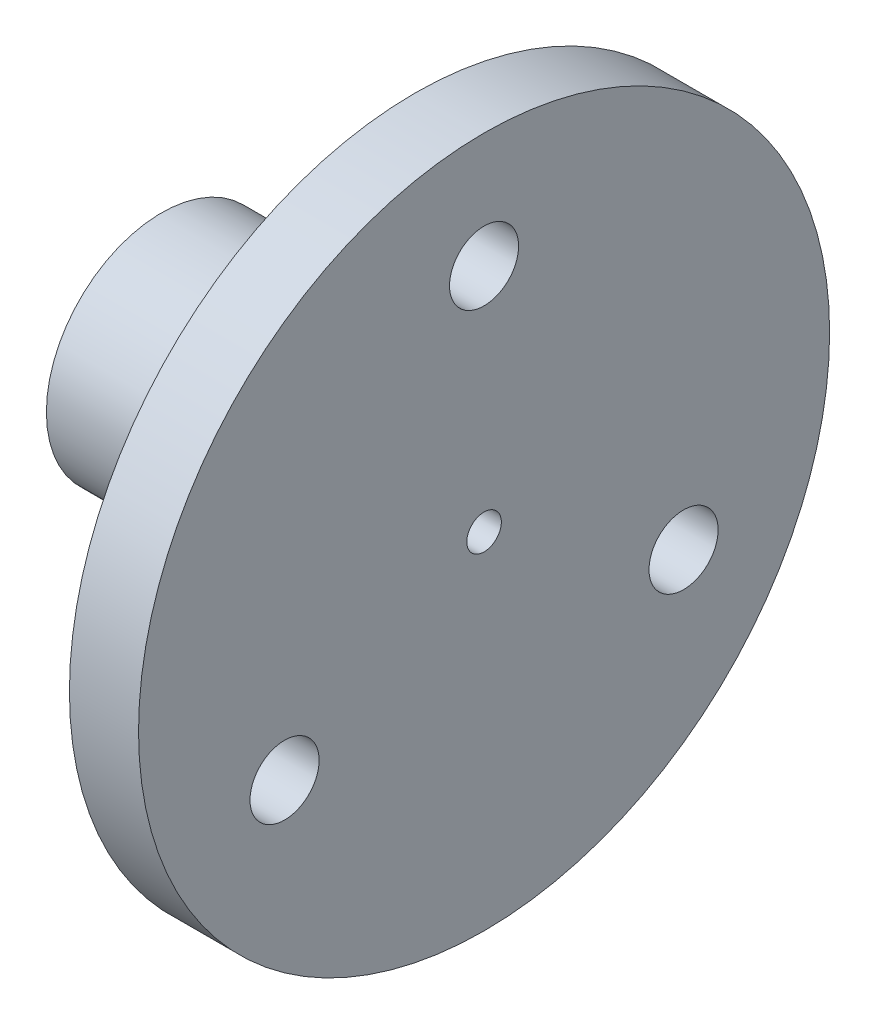
ISO-10303-21;
HEADER;
FILE_DESCRIPTION(('STEP AP214'),'2;1');
FILE_NAME('part.step','',(''),(''),'','','');
FILE_SCHEMA(('AUTOMOTIVE_DESIGN { 1 0 10303 214 1 1 1 1 }'));
ENDSEC;
DATA;
#1=APPLICATION_CONTEXT('core data for automotive mechanical design processes');
#2=APPLICATION_PROTOCOL_DEFINITION('international standard','automotive_design',2000,#1);
#3=PRODUCT_CONTEXT('',#1,'mechanical');
#4=PRODUCT('Part','Part','',(#3));
#5=PRODUCT_RELATED_PRODUCT_CATEGORY('part','',(#4));
#6=PRODUCT_DEFINITION_FORMATION('','',#4);
#7=PRODUCT_DEFINITION_CONTEXT('part definition',#1,'design');
#8=PRODUCT_DEFINITION('design','',#6,#7);
#9=PRODUCT_DEFINITION_SHAPE('','',#8);
#10=(LENGTH_UNIT() NAMED_UNIT(*) SI_UNIT(.MILLI.,.METRE.));
#11=(NAMED_UNIT(*) PLANE_ANGLE_UNIT() SI_UNIT($,.RADIAN.));
#12=(NAMED_UNIT(*) SI_UNIT($,.STERADIAN.) SOLID_ANGLE_UNIT());
#13=UNCERTAINTY_MEASURE_WITH_UNIT(LENGTH_MEASURE(1.E-05),#10,'distance_accuracy_value','');
#14=(GEOMETRIC_REPRESENTATION_CONTEXT(3) GLOBAL_UNCERTAINTY_ASSIGNED_CONTEXT((#13)) GLOBAL_UNIT_ASSIGNED_CONTEXT((#10,
#11,#12)) REPRESENTATION_CONTEXT('',''));
#15=CARTESIAN_POINT('',(0.,0.,0.));
#16=DIRECTION('',(0.,0.,1.));
#17=DIRECTION('',(1.,0.,0.));
#18=AXIS2_PLACEMENT_3D('',#15,#16,#17);
#19=CARTESIAN_POINT('',(14.,15.,0.));
#20=DIRECTION('',(-1.,0.,0.));
#21=DIRECTION('',(0.,0.,1.));
#22=AXIS2_PLACEMENT_3D('',#19,#20,#21);
#23=PLANE('',#22);
#24=CARTESIAN_POINT('',(14.,-5.00000000000004,8.66025403784437));
#25=DIRECTION('',(-1.,0.,0.));
#26=DIRECTION('',(0.,0.,1.));
#27=AXIS2_PLACEMENT_3D('',#24,#25,#26);
#28=CIRCLE('',#27,1.5);
#29=CARTESIAN_POINT('',(14.,-5.00000000000004,10.1602540378444));
#30=VERTEX_POINT('',#29);
#31=EDGE_CURVE('E65',#30,#30,#28,.T.);
#32=ORIENTED_EDGE('',*,*,#31,.T.);
#33=EDGE_LOOP('',(#32));
#34=FACE_BOUND('',#33,.T.);
#35=CARTESIAN_POINT('',(14.,-4.99999999999992,-8.66025403784444));
#36=DIRECTION('',(-1.,0.,0.));
#37=DIRECTION('',(0.,0.,1.));
#38=AXIS2_PLACEMENT_3D('',#35,#36,#37);
#39=CIRCLE('',#38,1.5);
#40=CARTESIAN_POINT('',(14.,-4.99999999999992,-7.16025403784444));
#41=VERTEX_POINT('',#40);
#42=EDGE_CURVE('E68',#41,#41,#39,.T.);
#43=ORIENTED_EDGE('',*,*,#42,.T.);
#44=EDGE_LOOP('',(#43));
#45=FACE_BOUND('',#44,.T.);
#46=CARTESIAN_POINT('',(14.,10.,0.));
#47=DIRECTION('',(-1.,0.,0.));
#48=DIRECTION('',(0.,0.,1.));
#49=AXIS2_PLACEMENT_3D('',#46,#47,#48);
#50=CIRCLE('',#49,1.5);
#51=CARTESIAN_POINT('',(14.,10.,1.5));
#52=VERTEX_POINT('',#51);
#53=EDGE_CURVE('E59',#52,#52,#50,.T.);
#54=ORIENTED_EDGE('',*,*,#53,.T.);
#55=EDGE_LOOP('',(#54));
#56=FACE_BOUND('',#55,.T.);
#57=CARTESIAN_POINT('',(14.,0.,0.));
#58=DIRECTION('',(-1.,0.,0.));
#59=DIRECTION('',(0.,0.,1.));
#60=AXIS2_PLACEMENT_3D('',#57,#58,#59);
#61=CIRCLE('',#60,15.);
#62=CARTESIAN_POINT('',(14.,0.,15.));
#63=VERTEX_POINT('',#62);
#64=EDGE_CURVE('E56',#63,#63,#61,.T.);
#65=ORIENTED_EDGE('',*,*,#64,.F.);
#66=EDGE_LOOP('',(#65));
#67=FACE_BOUND('',#66,.T.);
#68=CARTESIAN_POINT('',(14.,0.,0.));
#69=DIRECTION('',(-1.,0.,0.));
#70=DIRECTION('',(0.,0.,1.));
#71=AXIS2_PLACEMENT_3D('',#68,#69,#70);
#72=CIRCLE('',#71,0.749999999999995);
#73=CARTESIAN_POINT('',(14.,0.,0.749999999999995));
#74=VERTEX_POINT('',#73);
#75=EDGE_CURVE('E10',#74,#74,#72,.T.);
#76=ORIENTED_EDGE('',*,*,#75,.T.);
#77=EDGE_LOOP('',(#76));
#78=FACE_BOUND('',#77,.T.);
#79=ADVANCED_FACE('F34',(#34,#45,#56,#67,#78),#23,.F.);
#80=CARTESIAN_POINT('',(0.,0.,0.));
#81=DIRECTION('',(-1.,0.,0.));
#82=DIRECTION('',(0.,0.,1.));
#83=AXIS2_PLACEMENT_3D('',#80,#81,#82);
#84=CYLINDRICAL_SURFACE('',#83,0.749999999999994);
#85=ORIENTED_EDGE('',*,*,#75,.F.);
#86=EDGE_LOOP('',(#85));
#87=FACE_BOUND('',#86,.T.);
#88=CARTESIAN_POINT('',(0.,0.,0.));
#89=DIRECTION('',(-1.,0.,0.));
#90=DIRECTION('',(0.,0.,1.));
#91=AXIS2_PLACEMENT_3D('',#88,#89,#90);
#92=CIRCLE('',#91,0.749999999999994);
#93=CARTESIAN_POINT('',(0.,0.,0.749999999999994));
#94=VERTEX_POINT('',#93);
#95=EDGE_CURVE('E40',#94,#94,#92,.T.);
#96=ORIENTED_EDGE('',*,*,#95,.T.);
#97=EDGE_LOOP('',(#96));
#98=FACE_BOUND('',#97,.T.);
#99=ADVANCED_FACE('F102',(#87,#98),#84,.F.);
#100=CARTESIAN_POINT('',(0.,5.,0.));
#101=DIRECTION('',(1.,0.,0.));
#102=DIRECTION('',(0.,0.,-1.));
#103=AXIS2_PLACEMENT_3D('',#100,#101,#102);
#104=PLANE('',#103);
#105=ORIENTED_EDGE('',*,*,#95,.F.);
#106=EDGE_LOOP('',(#105));
#107=FACE_BOUND('',#106,.T.);
#108=CARTESIAN_POINT('',(0.,0.,0.));
#109=DIRECTION('',(-1.,0.,0.));
#110=DIRECTION('',(0.,0.,1.));
#111=AXIS2_PLACEMENT_3D('',#108,#109,#110);
#112=CIRCLE('',#111,5.);
#113=CARTESIAN_POINT('',(0.,0.,5.));
#114=VERTEX_POINT('',#113);
#115=EDGE_CURVE('E44',#114,#114,#112,.T.);
#116=ORIENTED_EDGE('',*,*,#115,.T.);
#117=EDGE_LOOP('',(#116));
#118=FACE_BOUND('',#117,.T.);
#119=ADVANCED_FACE('F107',(#107,#118),#104,.F.);
#120=CARTESIAN_POINT('',(0.,0.,0.));
#121=DIRECTION('',(-1.,0.,0.));
#122=DIRECTION('',(0.,0.,1.));
#123=AXIS2_PLACEMENT_3D('',#120,#121,#122);
#124=CYLINDRICAL_SURFACE('',#123,5.);
#125=ORIENTED_EDGE('',*,*,#115,.F.);
#126=EDGE_LOOP('',(#125));
#127=FACE_BOUND('',#126,.T.);
#128=CARTESIAN_POINT('',(11.,0.,0.));
#129=DIRECTION('',(-1.,0.,0.));
#130=DIRECTION('',(0.,0.,1.));
#131=AXIS2_PLACEMENT_3D('',#128,#129,#130);
#132=CIRCLE('',#131,5.);
#133=CARTESIAN_POINT('',(11.,0.,5.));
#134=VERTEX_POINT('',#133);
#135=EDGE_CURVE('E48',#134,#134,#132,.T.);
#136=ORIENTED_EDGE('',*,*,#135,.T.);
#137=EDGE_LOOP('',(#136));
#138=FACE_BOUND('',#137,.T.);
#139=ADVANCED_FACE('F85',(#127,#138),#124,.T.);
#140=CARTESIAN_POINT('',(11.,15.,0.));
#141=DIRECTION('',(1.,0.,0.));
#142=DIRECTION('',(0.,0.,-1.));
#143=AXIS2_PLACEMENT_3D('',#140,#141,#142);
#144=PLANE('',#143);
#145=CARTESIAN_POINT('',(11.,-5.00000000000004,8.66025403784437));
#146=DIRECTION('',(-1.,0.,0.));
#147=DIRECTION('',(0.,-0.866025403784436,-0.500000000000004));
#148=AXIS2_PLACEMENT_3D('',#145,#146,#147);
#149=CIRCLE('',#148,1.5);
#150=CARTESIAN_POINT('',(11.,-6.2990381056767,7.91025403784436));
#151=VERTEX_POINT('',#150);
#152=EDGE_CURVE('E71',#151,#151,#149,.T.);
#153=ORIENTED_EDGE('',*,*,#152,.F.);
#154=EDGE_LOOP('',(#153));
#155=FACE_BOUND('',#154,.T.);
#156=CARTESIAN_POINT('',(11.,-4.99999999999992,-8.66025403784444));
#157=DIRECTION('',(-1.,0.,0.));
#158=DIRECTION('',(0.,0.866025403784443,-0.499999999999992));
#159=AXIS2_PLACEMENT_3D('',#156,#157,#158);
#160=CIRCLE('',#159,1.5);
#161=CARTESIAN_POINT('',(11.,-3.70096189432326,-9.41025403784442));
#162=VERTEX_POINT('',#161);
#163=EDGE_CURVE('E72',#162,#162,#160,.T.);
#164=ORIENTED_EDGE('',*,*,#163,.F.);
#165=EDGE_LOOP('',(#164));
#166=FACE_BOUND('',#165,.T.);
#167=CARTESIAN_POINT('',(11.,10.,0.));
#168=DIRECTION('',(-1.,0.,0.));
#169=DIRECTION('',(0.,0.,1.));
#170=AXIS2_PLACEMENT_3D('',#167,#168,#169);
#171=CIRCLE('',#170,1.5);
#172=CARTESIAN_POINT('',(11.,10.,1.5));
#173=VERTEX_POINT('',#172);
#174=EDGE_CURVE('E62',#173,#173,#171,.T.);
#175=ORIENTED_EDGE('',*,*,#174,.F.);
#176=EDGE_LOOP('',(#175));
#177=FACE_BOUND('',#176,.T.);
#178=ORIENTED_EDGE('',*,*,#135,.F.);
#179=EDGE_LOOP('',(#178));
#180=FACE_BOUND('',#179,.T.);
#181=CARTESIAN_POINT('',(11.,0.,0.));
#182=DIRECTION('',(-1.,0.,0.));
#183=DIRECTION('',(0.,0.,1.));
#184=AXIS2_PLACEMENT_3D('',#181,#182,#183);
#185=CIRCLE('',#184,15.);
#186=CARTESIAN_POINT('',(11.,0.,15.));
#187=VERTEX_POINT('',#186);
#188=EDGE_CURVE('E53',#187,#187,#185,.T.);
#189=ORIENTED_EDGE('',*,*,#188,.T.);
#190=EDGE_LOOP('',(#189));
#191=FACE_BOUND('',#190,.T.);
#192=ADVANCED_FACE('F81',(#155,#166,#177,#180,#191),#144,.F.);
#193=CARTESIAN_POINT('',(0.,0.,0.));
#194=DIRECTION('',(-1.,0.,0.));
#195=DIRECTION('',(0.,0.,1.));
#196=AXIS2_PLACEMENT_3D('',#193,#194,#195);
#197=CYLINDRICAL_SURFACE('',#196,15.);
#198=ORIENTED_EDGE('',*,*,#188,.F.);
#199=EDGE_LOOP('',(#198));
#200=FACE_BOUND('',#199,.T.);
#201=ORIENTED_EDGE('',*,*,#64,.T.);
#202=EDGE_LOOP('',(#201));
#203=FACE_BOUND('',#202,.T.);
#204=ADVANCED_FACE('F84',(#200,#203),#197,.T.);
#205=CARTESIAN_POINT('',(21.,10.,0.));
#206=DIRECTION('',(-1.,0.,0.));
#207=DIRECTION('',(0.,0.,1.));
#208=AXIS2_PLACEMENT_3D('',#205,#206,#207);
#209=CYLINDRICAL_SURFACE('',#208,1.5);
#210=ORIENTED_EDGE('',*,*,#174,.T.);
#211=EDGE_LOOP('',(#210));
#212=FACE_BOUND('',#211,.T.);
#213=ORIENTED_EDGE('',*,*,#53,.F.);
#214=EDGE_LOOP('',(#213));
#215=FACE_BOUND('',#214,.T.);
#216=ADVANCED_FACE('F97',(#212,#215),#209,.F.);
#217=CARTESIAN_POINT('',(21.,-4.99999999999992,-8.66025403784444));
#218=DIRECTION('',(-1.,0.,0.));
#219=DIRECTION('',(0.,0.,1.));
#220=AXIS2_PLACEMENT_3D('',#217,#218,#219);
#221=CYLINDRICAL_SURFACE('',#220,1.5);
#222=ORIENTED_EDGE('',*,*,#163,.T.);
#223=EDGE_LOOP('',(#222));
#224=FACE_BOUND('',#223,.T.);
#225=ORIENTED_EDGE('',*,*,#42,.F.);
#226=EDGE_LOOP('',(#225));
#227=FACE_BOUND('',#226,.T.);
#228=ADVANCED_FACE('F116',(#224,#227),#221,.F.);
#229=CARTESIAN_POINT('',(21.,-5.00000000000004,8.66025403784437));
#230=DIRECTION('',(-1.,0.,0.));
#231=DIRECTION('',(0.,0.,1.));
#232=AXIS2_PLACEMENT_3D('',#229,#230,#231);
#233=CYLINDRICAL_SURFACE('',#232,1.5);
#234=ORIENTED_EDGE('',*,*,#152,.T.);
#235=EDGE_LOOP('',(#234));
#236=FACE_BOUND('',#235,.T.);
#237=ORIENTED_EDGE('',*,*,#31,.F.);
#238=EDGE_LOOP('',(#237));
#239=FACE_BOUND('',#238,.T.);
#240=ADVANCED_FACE('F78',(#236,#239),#233,.F.);
#241=CLOSED_SHELL('',(#79,#99,#119,#139,#192,#204,#216,#228,#240));
#242=MANIFOLD_SOLID_BREP('B2',#241);
#243=ADVANCED_BREP_SHAPE_REPRESENTATION('',(#18,#242),#14);
#244=SHAPE_DEFINITION_REPRESENTATION(#9,#243);
ENDSEC;
END-ISO-10303-21;
